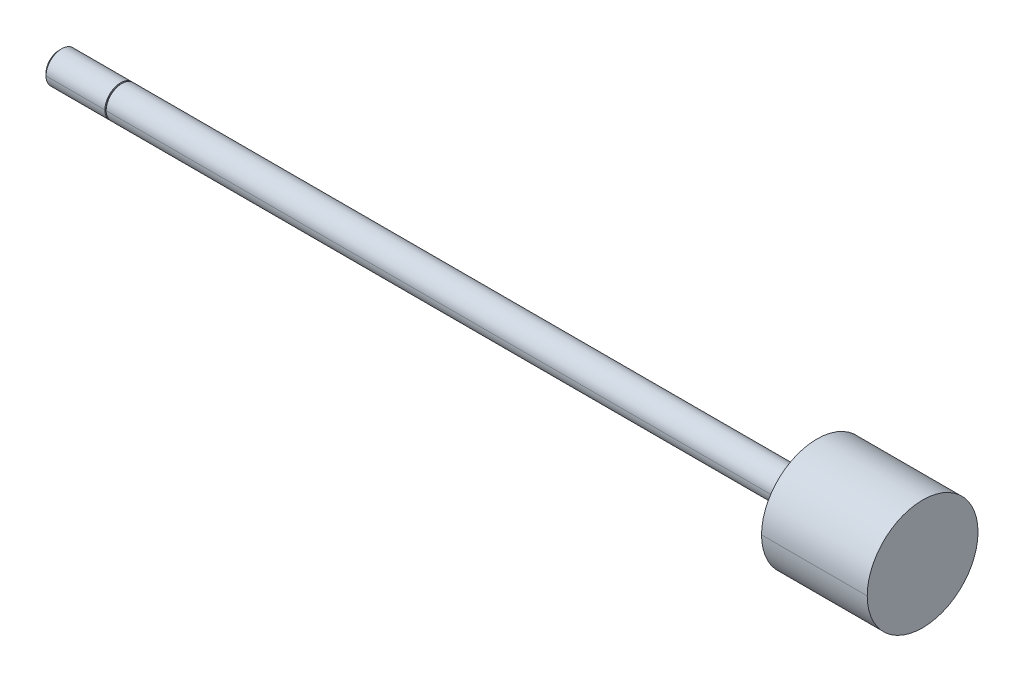
ISO-10303-21;
HEADER;
FILE_DESCRIPTION(('STEP AP214'),'2;1');
FILE_NAME('part.step','',(''),(''),'','','');
FILE_SCHEMA(('AUTOMOTIVE_DESIGN { 1 0 10303 214 1 1 1 1 }'));
ENDSEC;
DATA;
#1=APPLICATION_CONTEXT('core data for automotive mechanical design processes');
#2=APPLICATION_PROTOCOL_DEFINITION('international standard','automotive_design',2000,#1);
#3=PRODUCT_CONTEXT('',#1,'mechanical');
#4=PRODUCT('Part','Part','',(#3));
#5=PRODUCT_RELATED_PRODUCT_CATEGORY('part','',(#4));
#6=PRODUCT_DEFINITION_FORMATION('','',#4);
#7=PRODUCT_DEFINITION_CONTEXT('part definition',#1,'design');
#8=PRODUCT_DEFINITION('design','',#6,#7);
#9=PRODUCT_DEFINITION_SHAPE('','',#8);
#10=(LENGTH_UNIT() NAMED_UNIT(*) SI_UNIT(.MILLI.,.METRE.));
#11=(NAMED_UNIT(*) PLANE_ANGLE_UNIT() SI_UNIT($,.RADIAN.));
#12=(NAMED_UNIT(*) SI_UNIT($,.STERADIAN.) SOLID_ANGLE_UNIT());
#13=UNCERTAINTY_MEASURE_WITH_UNIT(LENGTH_MEASURE(1.E-05),#10,'distance_accuracy_value','');
#14=(GEOMETRIC_REPRESENTATION_CONTEXT(3) GLOBAL_UNCERTAINTY_ASSIGNED_CONTEXT((#13)) GLOBAL_UNIT_ASSIGNED_CONTEXT((#10,
#11,#12)) REPRESENTATION_CONTEXT('',''));
#15=CARTESIAN_POINT('',(0.,0.,0.));
#16=DIRECTION('',(0.,0.,1.));
#17=DIRECTION('',(1.,0.,0.));
#18=AXIS2_PLACEMENT_3D('',#15,#16,#17);
#19=CARTESIAN_POINT('',(0.,0.,0.));
#20=DIRECTION('',(-1.,0.,0.));
#21=DIRECTION('',(0.,-1.,0.));
#22=AXIS2_PLACEMENT_3D('',#19,#20,#21);
#23=CYLINDRICAL_SURFACE('',#22,2.921);
#24=CARTESIAN_POINT('',(0.,0.,0.));
#25=DIRECTION('',(1.,0.,0.));
#26=DIRECTION('',(0.,0.,-1.));
#27=AXIS2_PLACEMENT_3D('',#24,#25,#26);
#28=CIRCLE('',#27,2.921);
#29=CARTESIAN_POINT('',(0.,0.,-2.921));
#30=VERTEX_POINT('',#29);
#31=CARTESIAN_POINT('',(0.,0.,2.921));
#32=VERTEX_POINT('',#31);
#33=EDGE_CURVE('E11',#30,#32,#28,.T.);
#34=ORIENTED_EDGE('',*,*,#33,.F.);
#35=DIRECTION('',(-1.,0.,0.));
#36=VECTOR('',#35,1.);
#37=CARTESIAN_POINT('',(0.,0.,-2.921));
#38=LINE('',#37,#36);
#39=CARTESIAN_POINT('',(-0.254,0.,-2.921));
#40=VERTEX_POINT('',#39);
#41=EDGE_CURVE('E25',#30,#40,#38,.T.);
#42=ORIENTED_EDGE('',*,*,#41,.T.);
#43=CARTESIAN_POINT('',(-0.254,0.,0.));
#44=DIRECTION('',(1.,0.,0.));
#45=DIRECTION('',(0.,0.,-1.));
#46=AXIS2_PLACEMENT_3D('',#43,#44,#45);
#47=CIRCLE('',#46,2.921);
#48=CARTESIAN_POINT('',(-0.254,0.,2.921));
#49=VERTEX_POINT('',#48);
#50=EDGE_CURVE('E211',#40,#49,#47,.T.);
#51=ORIENTED_EDGE('',*,*,#50,.T.);
#52=DIRECTION('',(-1.,0.,0.));
#53=VECTOR('',#52,1.);
#54=CARTESIAN_POINT('',(0.,0.,2.921));
#55=LINE('',#54,#53);
#56=EDGE_CURVE('E206',#32,#49,#55,.T.);
#57=ORIENTED_EDGE('',*,*,#56,.F.);
#58=EDGE_LOOP('',(#34,#42,#51,#57));
#59=FACE_BOUND('',#58,.T.);
#60=ADVANCED_FACE('F17',(#59),#23,.T.);
#61=CARTESIAN_POINT('',(0.,0.,0.));
#62=DIRECTION('',(-1.,0.,0.));
#63=DIRECTION('',(0.,1.,0.));
#64=AXIS2_PLACEMENT_3D('',#61,#62,#63);
#65=CYLINDRICAL_SURFACE('',#64,2.921);
#66=CARTESIAN_POINT('',(-0.254,0.,0.));
#67=DIRECTION('',(1.,0.,0.));
#68=DIRECTION('',(0.,0.,-1.));
#69=AXIS2_PLACEMENT_3D('',#66,#67,#68);
#70=CIRCLE('',#69,2.921);
#71=EDGE_CURVE('E202',#49,#40,#70,.T.);
#72=ORIENTED_EDGE('',*,*,#71,.T.);
#73=ORIENTED_EDGE('',*,*,#41,.F.);
#74=CARTESIAN_POINT('',(0.,0.,0.));
#75=DIRECTION('',(1.,0.,0.));
#76=DIRECTION('',(0.,0.,-1.));
#77=AXIS2_PLACEMENT_3D('',#74,#75,#76);
#78=CIRCLE('',#77,2.921);
#79=EDGE_CURVE('E197',#32,#30,#78,.T.);
#80=ORIENTED_EDGE('',*,*,#79,.F.);
#81=ORIENTED_EDGE('',*,*,#56,.T.);
#82=EDGE_LOOP('',(#72,#73,#80,#81));
#83=FACE_BOUND('',#82,.T.);
#84=ADVANCED_FACE('F224',(#83),#65,.T.);
#85=CARTESIAN_POINT('',(0.,2.921,0.));
#86=DIRECTION('',(1.,0.,0.));
#87=DIRECTION('',(0.,0.,-1.));
#88=AXIS2_PLACEMENT_3D('',#85,#86,#87);
#89=PLANE('',#88);
#90=CARTESIAN_POINT('',(0.,0.,0.));
#91=DIRECTION('',(1.,0.,0.));
#92=DIRECTION('',(0.,0.,-1.));
#93=AXIS2_PLACEMENT_3D('',#90,#91,#92);
#94=CIRCLE('',#93,3.175);
#95=CARTESIAN_POINT('',(0.,0.,-3.175));
#96=VERTEX_POINT('',#95);
#97=CARTESIAN_POINT('',(0.,0.,3.175));
#98=VERTEX_POINT('',#97);
#99=EDGE_CURVE('E192',#96,#98,#94,.T.);
#100=ORIENTED_EDGE('',*,*,#99,.F.);
#101=CARTESIAN_POINT('',(0.,0.,0.));
#102=DIRECTION('',(1.,0.,0.));
#103=DIRECTION('',(0.,0.,-1.));
#104=AXIS2_PLACEMENT_3D('',#101,#102,#103);
#105=CIRCLE('',#104,3.175);
#106=EDGE_CURVE('E187',#98,#96,#105,.T.);
#107=ORIENTED_EDGE('',*,*,#106,.F.);
#108=EDGE_LOOP('',(#100,#107));
#109=FACE_BOUND('',#108,.T.);
#110=ORIENTED_EDGE('',*,*,#33,.T.);
#111=ORIENTED_EDGE('',*,*,#79,.T.);
#112=EDGE_LOOP('',(#110,#111));
#113=FACE_BOUND('',#112,.T.);
#114=ADVANCED_FACE('F249',(#109,#113),#89,.F.);
#115=CARTESIAN_POINT('',(161.8488,0.,0.));
#116=DIRECTION('',(-1.,0.,0.));
#117=DIRECTION('',(0.,1.,0.));
#118=AXIS2_PLACEMENT_3D('',#115,#116,#117);
#119=CYLINDRICAL_SURFACE('',#118,3.175);
#120=ORIENTED_EDGE('',*,*,#106,.T.);
#121=DIRECTION('',(-1.,0.,0.));
#122=VECTOR('',#121,1.);
#123=CARTESIAN_POINT('',(140.4874,0.,-3.175));
#124=LINE('',#123,#122);
#125=CARTESIAN_POINT('',(140.4874,0.,-3.175));
#126=VERTEX_POINT('',#125);
#127=EDGE_CURVE('E182',#126,#96,#124,.T.);
#128=ORIENTED_EDGE('',*,*,#127,.F.);
#129=CARTESIAN_POINT('',(140.4874,0.,0.));
#130=DIRECTION('',(1.,0.,0.));
#131=DIRECTION('',(0.,0.,-1.));
#132=AXIS2_PLACEMENT_3D('',#129,#130,#131);
#133=CIRCLE('',#132,3.175);
#134=CARTESIAN_POINT('',(140.4874,0.,3.175));
#135=VERTEX_POINT('',#134);
#136=EDGE_CURVE('E177',#135,#126,#133,.T.);
#137=ORIENTED_EDGE('',*,*,#136,.F.);
#138=DIRECTION('',(-1.,0.,0.));
#139=VECTOR('',#138,1.);
#140=CARTESIAN_POINT('',(140.4874,0.,3.175));
#141=LINE('',#140,#139);
#142=EDGE_CURVE('E172',#135,#98,#141,.T.);
#143=ORIENTED_EDGE('',*,*,#142,.T.);
#144=EDGE_LOOP('',(#120,#128,#137,#143));
#145=FACE_BOUND('',#144,.T.);
#146=ADVANCED_FACE('F253',(#145),#119,.T.);
#147=CARTESIAN_POINT('',(161.8488,0.,0.));
#148=DIRECTION('',(-1.,0.,0.));
#149=DIRECTION('',(0.,-1.,0.));
#150=AXIS2_PLACEMENT_3D('',#147,#148,#149);
#151=CYLINDRICAL_SURFACE('',#150,3.175);
#152=CARTESIAN_POINT('',(140.4874,0.,0.));
#153=DIRECTION('',(1.,0.,0.));
#154=DIRECTION('',(0.,0.,-1.));
#155=AXIS2_PLACEMENT_3D('',#152,#153,#154);
#156=CIRCLE('',#155,3.175);
#157=EDGE_CURVE('E167',#126,#135,#156,.T.);
#158=ORIENTED_EDGE('',*,*,#157,.F.);
#159=ORIENTED_EDGE('',*,*,#127,.T.);
#160=ORIENTED_EDGE('',*,*,#99,.T.);
#161=ORIENTED_EDGE('',*,*,#142,.F.);
#162=EDGE_LOOP('',(#158,#159,#160,#161));
#163=FACE_BOUND('',#162,.T.);
#164=ADVANCED_FACE('F259',(#163),#151,.T.);
#165=CARTESIAN_POINT('',(140.4874,3.175,0.));
#166=DIRECTION('',(1.,0.,0.));
#167=DIRECTION('',(0.,0.,-1.));
#168=AXIS2_PLACEMENT_3D('',#165,#166,#167);
#169=PLANE('',#168);
#170=CARTESIAN_POINT('',(140.4874,0.,0.));
#171=DIRECTION('',(1.,0.,0.));
#172=DIRECTION('',(0.,0.,-1.));
#173=AXIS2_PLACEMENT_3D('',#170,#171,#172);
#174=CIRCLE('',#173,11.19505);
#175=CARTESIAN_POINT('',(140.4874,0.,-11.19505));
#176=VERTEX_POINT('',#175);
#177=CARTESIAN_POINT('',(140.4874,0.,11.19505));
#178=VERTEX_POINT('',#177);
#179=EDGE_CURVE('E162',#176,#178,#174,.T.);
#180=ORIENTED_EDGE('',*,*,#179,.F.);
#181=CARTESIAN_POINT('',(140.4874,0.,0.));
#182=DIRECTION('',(1.,0.,0.));
#183=DIRECTION('',(0.,0.,-1.));
#184=AXIS2_PLACEMENT_3D('',#181,#182,#183);
#185=CIRCLE('',#184,11.19505);
#186=EDGE_CURVE('E157',#178,#176,#185,.T.);
#187=ORIENTED_EDGE('',*,*,#186,.F.);
#188=EDGE_LOOP('',(#180,#187));
#189=FACE_BOUND('',#188,.T.);
#190=ORIENTED_EDGE('',*,*,#157,.T.);
#191=ORIENTED_EDGE('',*,*,#136,.T.);
#192=EDGE_LOOP('',(#190,#191));
#193=FACE_BOUND('',#192,.T.);
#194=ADVANCED_FACE('F263',(#189,#193),#169,.F.);
#195=CARTESIAN_POINT('',(161.8488,0.,0.));
#196=DIRECTION('',(-1.,0.,0.));
#197=DIRECTION('',(0.,1.,0.));
#198=AXIS2_PLACEMENT_3D('',#195,#196,#197);
#199=CYLINDRICAL_SURFACE('',#198,11.19505);
#200=ORIENTED_EDGE('',*,*,#186,.T.);
#201=DIRECTION('',(-1.,0.,0.));
#202=VECTOR('',#201,1.);
#203=CARTESIAN_POINT('',(161.8488,0.,-11.19505));
#204=LINE('',#203,#202);
#205=CARTESIAN_POINT('',(161.8488,0.,-11.19505));
#206=VERTEX_POINT('',#205);
#207=EDGE_CURVE('E152',#206,#176,#204,.T.);
#208=ORIENTED_EDGE('',*,*,#207,.F.);
#209=CARTESIAN_POINT('',(161.8488,0.,0.));
#210=DIRECTION('',(1.,0.,0.));
#211=DIRECTION('',(0.,0.,-1.));
#212=AXIS2_PLACEMENT_3D('',#209,#210,#211);
#213=CIRCLE('',#212,11.19505);
#214=CARTESIAN_POINT('',(161.8488,0.,11.19505));
#215=VERTEX_POINT('',#214);
#216=EDGE_CURVE('E147',#215,#206,#213,.T.);
#217=ORIENTED_EDGE('',*,*,#216,.F.);
#218=DIRECTION('',(-1.,0.,0.));
#219=VECTOR('',#218,1.);
#220=CARTESIAN_POINT('',(161.8488,0.,11.19505));
#221=LINE('',#220,#219);
#222=EDGE_CURVE('E142',#215,#178,#221,.T.);
#223=ORIENTED_EDGE('',*,*,#222,.T.);
#224=EDGE_LOOP('',(#200,#208,#217,#223));
#225=FACE_BOUND('',#224,.T.);
#226=ADVANCED_FACE('F267',(#225),#199,.T.);
#227=CARTESIAN_POINT('',(161.8488,0.,0.));
#228=DIRECTION('',(-1.,0.,0.));
#229=DIRECTION('',(0.,-1.,0.));
#230=AXIS2_PLACEMENT_3D('',#227,#228,#229);
#231=CYLINDRICAL_SURFACE('',#230,11.19505);
#232=CARTESIAN_POINT('',(161.8488,0.,0.));
#233=DIRECTION('',(1.,0.,0.));
#234=DIRECTION('',(0.,0.,-1.));
#235=AXIS2_PLACEMENT_3D('',#232,#233,#234);
#236=CIRCLE('',#235,11.19505);
#237=EDGE_CURVE('E137',#206,#215,#236,.T.);
#238=ORIENTED_EDGE('',*,*,#237,.F.);
#239=ORIENTED_EDGE('',*,*,#207,.T.);
#240=ORIENTED_EDGE('',*,*,#179,.T.);
#241=ORIENTED_EDGE('',*,*,#222,.F.);
#242=EDGE_LOOP('',(#238,#239,#240,#241));
#243=FACE_BOUND('',#242,.T.);
#244=ADVANCED_FACE('F271',(#243),#231,.T.);
#245=CARTESIAN_POINT('',(161.8488,11.19505,0.));
#246=DIRECTION('',(-1.,0.,0.));
#247=DIRECTION('',(0.,0.,1.));
#248=AXIS2_PLACEMENT_3D('',#245,#246,#247);
#249=PLANE('',#248);
#250=ORIENTED_EDGE('',*,*,#237,.T.);
#251=ORIENTED_EDGE('',*,*,#216,.T.);
#252=EDGE_LOOP('',(#250,#251));
#253=FACE_BOUND('',#252,.T.);
#254=ADVANCED_FACE('F229',(#253),#249,.F.);
#255=CARTESIAN_POINT('',(-0.254,3.429,0.));
#256=DIRECTION('',(-1.,0.,0.));
#257=DIRECTION('',(0.,0.,1.));
#258=AXIS2_PLACEMENT_3D('',#255,#256,#257);
#259=PLANE('',#258);
#260=ORIENTED_EDGE('',*,*,#50,.F.);
#261=ORIENTED_EDGE('',*,*,#71,.F.);
#262=EDGE_LOOP('',(#260,#261));
#263=FACE_BOUND('',#262,.T.);
#264=CARTESIAN_POINT('',(-0.254000000000005,0.,0.));
#265=DIRECTION('',(-1.,0.,0.));
#266=DIRECTION('',(0.,0.,1.));
#267=AXIS2_PLACEMENT_3D('',#264,#265,#266);
#268=CIRCLE('',#267,3.175);
#269=CARTESIAN_POINT('',(-0.254000000000005,0.,3.175));
#270=VERTEX_POINT('',#269);
#271=CARTESIAN_POINT('',(-0.254000000000019,0.,-3.175));
#272=VERTEX_POINT('',#271);
#273=EDGE_CURVE('E132',#270,#272,#268,.T.);
#274=ORIENTED_EDGE('',*,*,#273,.F.);
#275=CARTESIAN_POINT('',(-0.254000000000005,0.,0.));
#276=DIRECTION('',(-1.,0.,0.));
#277=DIRECTION('',(0.,0.,1.));
#278=AXIS2_PLACEMENT_3D('',#275,#276,#277);
#279=CIRCLE('',#278,3.175);
#280=EDGE_CURVE('E127',#272,#270,#279,.T.);
#281=ORIENTED_EDGE('',*,*,#280,.F.);
#282=EDGE_LOOP('',(#274,#281));
#283=FACE_BOUND('',#282,.T.);
#284=ADVANCED_FACE('F225',(#263,#283),#259,.F.);
#285=CARTESIAN_POINT('',(161.8488,0.,0.));
#286=DIRECTION('',(-1.,0.,0.));
#287=DIRECTION('',(0.,1.,0.));
#288=AXIS2_PLACEMENT_3D('',#285,#286,#287);
#289=CYLINDRICAL_SURFACE('',#288,3.175);
#290=CARTESIAN_POINT('',(-12.15898,0.,0.));
#291=DIRECTION('',(1.,0.,0.));
#292=DIRECTION('',(0.,0.,-1.));
#293=AXIS2_PLACEMENT_3D('',#290,#291,#292);
#294=CIRCLE('',#293,3.175);
#295=CARTESIAN_POINT('',(-12.15898,0.,3.175));
#296=VERTEX_POINT('',#295);
#297=CARTESIAN_POINT('',(-12.15898,0.,-3.175));
#298=VERTEX_POINT('',#297);
#299=EDGE_CURVE('E98',#296,#298,#294,.T.);
#300=ORIENTED_EDGE('',*,*,#299,.T.);
#301=DIRECTION('',(-1.,0.,0.));
#302=VECTOR('',#301,1.);
#303=CARTESIAN_POINT('',(-0.254000000000019,0.,-3.175));
#304=LINE('',#303,#302);
#305=EDGE_CURVE('E119',#272,#298,#304,.T.);
#306=ORIENTED_EDGE('',*,*,#305,.F.);
#307=ORIENTED_EDGE('',*,*,#280,.T.);
#308=DIRECTION('',(-1.,0.,0.));
#309=VECTOR('',#308,1.);
#310=CARTESIAN_POINT('',(-0.254000000000019,0.,3.175));
#311=LINE('',#310,#309);
#312=EDGE_CURVE('E115',#270,#296,#311,.T.);
#313=ORIENTED_EDGE('',*,*,#312,.T.);
#314=EDGE_LOOP('',(#300,#306,#307,#313));
#315=FACE_BOUND('',#314,.T.);
#316=ADVANCED_FACE('F228',(#315),#289,.T.);
#317=CARTESIAN_POINT('',(161.8488,0.,0.));
#318=DIRECTION('',(-1.,0.,0.));
#319=DIRECTION('',(0.,-1.,0.));
#320=AXIS2_PLACEMENT_3D('',#317,#318,#319);
#321=CYLINDRICAL_SURFACE('',#320,3.175);
#322=ORIENTED_EDGE('',*,*,#273,.T.);
#323=ORIENTED_EDGE('',*,*,#305,.T.);
#324=CARTESIAN_POINT('',(-12.15898,0.,0.));
#325=DIRECTION('',(1.,0.,0.));
#326=DIRECTION('',(0.,0.,-1.));
#327=AXIS2_PLACEMENT_3D('',#324,#325,#326);
#328=CIRCLE('',#327,3.175);
#329=EDGE_CURVE('E110',#298,#296,#328,.T.);
#330=ORIENTED_EDGE('',*,*,#329,.T.);
#331=ORIENTED_EDGE('',*,*,#312,.F.);
#332=EDGE_LOOP('',(#322,#323,#330,#331));
#333=FACE_BOUND('',#332,.T.);
#334=ADVANCED_FACE('F235',(#333),#321,.T.);
#335=CARTESIAN_POINT('',(-12.7,0.,0.));
#336=DIRECTION('',(1.,0.,0.));
#337=DIRECTION('',(0.,-1.,0.));
#338=AXIS2_PLACEMENT_3D('',#335,#336,#337);
#339=CONICAL_SURFACE('',#338,2.63398,0.7853981634);
#340=ORIENTED_EDGE('',*,*,#329,.F.);
#341=DIRECTION('',(0.707106781184742,0.,-0.707106781188353));
#342=VECTOR('',#341,1.);
#343=CARTESIAN_POINT('',(-12.7,0.,-2.63398));
#344=LINE('',#343,#342);
#345=CARTESIAN_POINT('',(-12.7,0.,-2.63398));
#346=VERTEX_POINT('',#345);
#347=EDGE_CURVE('E90',#346,#298,#344,.T.);
#348=ORIENTED_EDGE('',*,*,#347,.F.);
#349=CARTESIAN_POINT('',(-12.7,0.,0.));
#350=DIRECTION('',(1.,0.,0.));
#351=DIRECTION('',(0.,0.,-1.));
#352=AXIS2_PLACEMENT_3D('',#349,#350,#351);
#353=CIRCLE('',#352,2.63398);
#354=CARTESIAN_POINT('',(-12.7,0.,2.63398));
#355=VERTEX_POINT('',#354);
#356=EDGE_CURVE('E83',#346,#355,#353,.T.);
#357=ORIENTED_EDGE('',*,*,#356,.T.);
#358=DIRECTION('',(0.707106781184742,0.,0.707106781188353));
#359=VECTOR('',#358,1.);
#360=CARTESIAN_POINT('',(-12.7,0.,2.63398));
#361=LINE('',#360,#359);
#362=EDGE_CURVE('E87',#355,#296,#361,.T.);
#363=ORIENTED_EDGE('',*,*,#362,.T.);
#364=EDGE_LOOP('',(#340,#348,#357,#363));
#365=FACE_BOUND('',#364,.T.);
#366=ADVANCED_FACE('F86',(#365),#339,.T.);
#367=CARTESIAN_POINT('',(-12.7,0.,0.));
#368=DIRECTION('',(1.,0.,0.));
#369=DIRECTION('',(0.,1.,0.));
#370=AXIS2_PLACEMENT_3D('',#367,#368,#369);
#371=CONICAL_SURFACE('',#370,2.63398,0.7853981634);
#372=CARTESIAN_POINT('',(-12.7,0.,0.));
#373=DIRECTION('',(1.,0.,0.));
#374=DIRECTION('',(0.,0.,-1.));
#375=AXIS2_PLACEMENT_3D('',#372,#373,#374);
#376=CIRCLE('',#375,2.63398);
#377=EDGE_CURVE('E97',#355,#346,#376,.T.);
#378=ORIENTED_EDGE('',*,*,#377,.T.);
#379=ORIENTED_EDGE('',*,*,#347,.T.);
#380=ORIENTED_EDGE('',*,*,#299,.F.);
#381=ORIENTED_EDGE('',*,*,#362,.F.);
#382=EDGE_LOOP('',(#378,#379,#380,#381));
#383=FACE_BOUND('',#382,.T.);
#384=ADVANCED_FACE('F96',(#383),#371,.T.);
#385=CARTESIAN_POINT('',(-12.7,0.,0.));
#386=DIRECTION('',(1.,0.,0.));
#387=DIRECTION('',(0.,0.,-1.));
#388=AXIS2_PLACEMENT_3D('',#385,#386,#387);
#389=PLANE('',#388);
#390=ORIENTED_EDGE('',*,*,#356,.F.);
#391=ORIENTED_EDGE('',*,*,#377,.F.);
#392=EDGE_LOOP('',(#390,#391));
#393=FACE_BOUND('',#392,.T.);
#394=ADVANCED_FACE('F100',(#393),#389,.F.);
#395=CLOSED_SHELL('',(#60,#84,#114,#146,#164,#194,#226,#244,#254,#284,#316,#334,#366,#384,#394));
#396=MANIFOLD_SOLID_BREP('B1',#395);
#397=ADVANCED_BREP_SHAPE_REPRESENTATION('',(#18,#396),#14);
#398=SHAPE_DEFINITION_REPRESENTATION(#9,#397);
ENDSEC;
END-ISO-10303-21;
